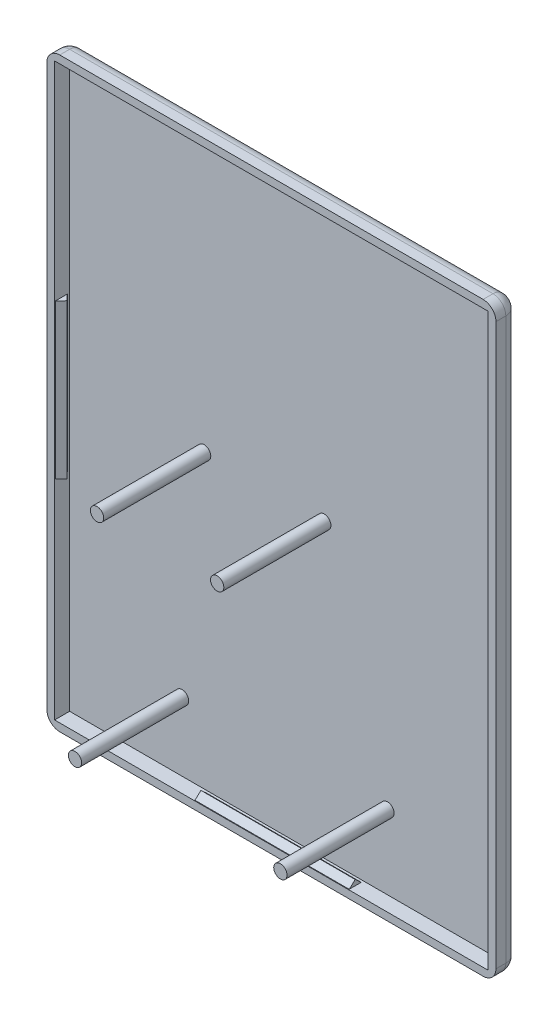
ISO-10303-21;
HEADER;
FILE_DESCRIPTION(('STEP AP214'),'2;1');
FILE_NAME('part.step','',(''),(''),'','','');
FILE_SCHEMA(('AUTOMOTIVE_DESIGN { 1 0 10303 214 1 1 1 1 }'));
ENDSEC;
DATA;
#1=APPLICATION_CONTEXT('core data for automotive mechanical design processes');
#2=APPLICATION_PROTOCOL_DEFINITION('international standard','automotive_design',2000,#1);
#3=PRODUCT_CONTEXT('',#1,'mechanical');
#4=PRODUCT('Part','Part','',(#3));
#5=PRODUCT_RELATED_PRODUCT_CATEGORY('part','',(#4));
#6=PRODUCT_DEFINITION_FORMATION('','',#4);
#7=PRODUCT_DEFINITION_CONTEXT('part definition',#1,'design');
#8=PRODUCT_DEFINITION('design','',#6,#7);
#9=PRODUCT_DEFINITION_SHAPE('','',#8);
#10=(LENGTH_UNIT() NAMED_UNIT(*) SI_UNIT(.MILLI.,.METRE.));
#11=(NAMED_UNIT(*) PLANE_ANGLE_UNIT() SI_UNIT($,.RADIAN.));
#12=(NAMED_UNIT(*) SI_UNIT($,.STERADIAN.) SOLID_ANGLE_UNIT());
#13=UNCERTAINTY_MEASURE_WITH_UNIT(LENGTH_MEASURE(1.E-05),#10,'distance_accuracy_value','');
#14=(GEOMETRIC_REPRESENTATION_CONTEXT(3) GLOBAL_UNCERTAINTY_ASSIGNED_CONTEXT((#13)) GLOBAL_UNIT_ASSIGNED_CONTEXT((#10,
#11,#12)) REPRESENTATION_CONTEXT('',''));
#15=CARTESIAN_POINT('',(0.,0.,0.));
#16=DIRECTION('',(0.,0.,1.));
#17=DIRECTION('',(1.,0.,0.));
#18=AXIS2_PLACEMENT_3D('',#15,#16,#17);
#19=CARTESIAN_POINT('',(0.,0.,0.));
#20=DIRECTION('',(0.,0.,-1.));
#21=DIRECTION('',(-1.,0.,0.));
#22=AXIS2_PLACEMENT_3D('',#19,#20,#21);
#23=PLANE('',#22);
#24=DIRECTION('',(0.,1.,0.));
#25=VECTOR('',#24,1.);
#26=CARTESIAN_POINT('',(52.4,-66.6,0.));
#27=LINE('',#26,#25);
#28=CARTESIAN_POINT('',(52.4,-65.4,0.));
#29=VERTEX_POINT('',#28);
#30=CARTESIAN_POINT('',(52.4,65.4,0.));
#31=VERTEX_POINT('',#30);
#32=EDGE_CURVE('E411',#29,#31,#27,.T.);
#33=ORIENTED_EDGE('',*,*,#32,.T.);
#34=CARTESIAN_POINT('',(49.4,65.4,0.));
#35=DIRECTION('',(0.,0.,-1.));
#36=DIRECTION('',(-1.,0.,0.));
#37=AXIS2_PLACEMENT_3D('',#34,#35,#36);
#38=CIRCLE('',#37,3.);
#39=CARTESIAN_POINT('',(49.4,68.4,0.));
#40=VERTEX_POINT('',#39);
#41=EDGE_CURVE('E442',#31,#40,#38,.F.);
#42=ORIENTED_EDGE('',*,*,#41,.T.);
#43=DIRECTION('',(-1.,0.,0.));
#44=VECTOR('',#43,1.);
#45=CARTESIAN_POINT('',(-50.6,68.4,0.));
#46=LINE('',#45,#44);
#47=CARTESIAN_POINT('',(-49.4,68.4,0.));
#48=VERTEX_POINT('',#47);
#49=EDGE_CURVE('E420',#40,#48,#46,.T.);
#50=ORIENTED_EDGE('',*,*,#49,.T.);
#51=CARTESIAN_POINT('',(-49.4,65.4,0.));
#52=DIRECTION('',(0.,0.,-1.));
#53=DIRECTION('',(-1.,0.,0.));
#54=AXIS2_PLACEMENT_3D('',#51,#52,#53);
#55=CIRCLE('',#54,3.);
#56=CARTESIAN_POINT('',(-52.4,65.4,0.));
#57=VERTEX_POINT('',#56);
#58=EDGE_CURVE('E436',#48,#57,#55,.F.);
#59=ORIENTED_EDGE('',*,*,#58,.T.);
#60=DIRECTION('',(0.,-1.,0.));
#61=VECTOR('',#60,1.);
#62=CARTESIAN_POINT('',(-52.4,-66.6,0.));
#63=LINE('',#62,#61);
#64=CARTESIAN_POINT('',(-52.4,-65.4,0.));
#65=VERTEX_POINT('',#64);
#66=EDGE_CURVE('E423',#57,#65,#63,.T.);
#67=ORIENTED_EDGE('',*,*,#66,.T.);
#68=CARTESIAN_POINT('',(-49.4,-65.4,0.));
#69=DIRECTION('',(0.,0.,-1.));
#70=DIRECTION('',(-1.,0.,0.));
#71=AXIS2_PLACEMENT_3D('',#68,#69,#70);
#72=CIRCLE('',#71,3.);
#73=CARTESIAN_POINT('',(-49.4,-68.4,0.));
#74=VERTEX_POINT('',#73);
#75=EDGE_CURVE('E438',#65,#74,#72,.F.);
#76=ORIENTED_EDGE('',*,*,#75,.T.);
#77=DIRECTION('',(1.,0.,0.));
#78=VECTOR('',#77,1.);
#79=CARTESIAN_POINT('',(-50.6,-68.4,0.));
#80=LINE('',#79,#78);
#81=CARTESIAN_POINT('',(49.4,-68.4,0.));
#82=VERTEX_POINT('',#81);
#83=EDGE_CURVE('E426',#74,#82,#80,.T.);
#84=ORIENTED_EDGE('',*,*,#83,.T.);
#85=CARTESIAN_POINT('',(49.4,-65.4,0.));
#86=DIRECTION('',(0.,0.,-1.));
#87=DIRECTION('',(-1.,0.,0.));
#88=AXIS2_PLACEMENT_3D('',#85,#86,#87);
#89=CIRCLE('',#88,3.);
#90=EDGE_CURVE('E440',#82,#29,#89,.F.);
#91=ORIENTED_EDGE('',*,*,#90,.T.);
#92=EDGE_LOOP('',(#33,#42,#50,#59,#67,#76,#84,#91));
#93=FACE_BOUND('',#92,.T.);
#94=DIRECTION('',(0.,1.,0.));
#95=VECTOR('',#94,1.);
#96=CARTESIAN_POINT('',(50.6,-66.6,0.));
#97=LINE('',#96,#95);
#98=CARTESIAN_POINT('',(50.6,-66.6,0.));
#99=VERTEX_POINT('',#98);
#100=CARTESIAN_POINT('',(50.6,66.6,0.));
#101=VERTEX_POINT('',#100);
#102=EDGE_CURVE('E398',#99,#101,#97,.T.);
#103=ORIENTED_EDGE('',*,*,#102,.F.);
#104=DIRECTION('',(1.,0.,0.));
#105=VECTOR('',#104,1.);
#106=CARTESIAN_POINT('',(-50.6,-66.6,0.));
#107=LINE('',#106,#105);
#108=CARTESIAN_POINT('',(-50.6,-66.6,0.));
#109=VERTEX_POINT('',#108);
#110=EDGE_CURVE('E388',#109,#99,#107,.T.);
#111=ORIENTED_EDGE('',*,*,#110,.F.);
#112=DIRECTION('',(0.,-1.,0.));
#113=VECTOR('',#112,1.);
#114=CARTESIAN_POINT('',(-50.6,-66.6,0.));
#115=LINE('',#114,#113);
#116=CARTESIAN_POINT('',(-50.6,66.6,0.));
#117=VERTEX_POINT('',#116);
#118=EDGE_CURVE('E405',#117,#109,#115,.T.);
#119=ORIENTED_EDGE('',*,*,#118,.F.);
#120=DIRECTION('',(-1.,0.,0.));
#121=VECTOR('',#120,1.);
#122=CARTESIAN_POINT('',(-50.6,66.6,0.));
#123=LINE('',#122,#121);
#124=EDGE_CURVE('E401',#101,#117,#123,.T.);
#125=ORIENTED_EDGE('',*,*,#124,.F.);
#126=EDGE_LOOP('',(#103,#111,#119,#125));
#127=FACE_BOUND('',#126,.T.);
#128=ADVANCED_FACE('F38',(#93,#127),#23,.F.);
#129=CARTESIAN_POINT('',(52.4,-66.6,-3.5));
#130=DIRECTION('',(1.,0.,0.));
#131=DIRECTION('',(0.,0.,-1.));
#132=AXIS2_PLACEMENT_3D('',#129,#130,#131);
#133=PLANE('',#132);
#134=DIRECTION('',(0.,1.,0.));
#135=VECTOR('',#134,1.);
#136=CARTESIAN_POINT('',(52.4,-66.6,-2.3));
#137=LINE('',#136,#135);
#138=CARTESIAN_POINT('',(52.4,-65.4,-2.3));
#139=VERTEX_POINT('',#138);
#140=CARTESIAN_POINT('',(52.4,65.4,-2.3));
#141=VERTEX_POINT('',#140);
#142=EDGE_CURVE('E429',#139,#141,#137,.T.);
#143=ORIENTED_EDGE('',*,*,#142,.T.);
#144=DIRECTION('',(0.,0.,1.));
#145=VECTOR('',#144,1.);
#146=CARTESIAN_POINT('',(52.4,65.4,-3.5));
#147=LINE('',#146,#145);
#148=EDGE_CURVE('E433',#141,#31,#147,.T.);
#149=ORIENTED_EDGE('',*,*,#148,.T.);
#150=ORIENTED_EDGE('',*,*,#32,.F.);
#151=DIRECTION('',(0.,0.,1.));
#152=VECTOR('',#151,1.);
#153=CARTESIAN_POINT('',(52.4,-65.4,-3.5));
#154=LINE('',#153,#152);
#155=EDGE_CURVE('E431',#29,#139,#154,.F.);
#156=ORIENTED_EDGE('',*,*,#155,.T.);
#157=EDGE_LOOP('',(#143,#149,#150,#156));
#158=FACE_BOUND('',#157,.T.);
#159=ADVANCED_FACE('F542',(#158),#133,.T.);
#160=CARTESIAN_POINT('',(-50.6,-68.4,-3.5));
#161=DIRECTION('',(0.,-1.,0.));
#162=DIRECTION('',(0.,0.,-1.));
#163=AXIS2_PLACEMENT_3D('',#160,#161,#162);
#164=PLANE('',#163);
#165=DIRECTION('',(1.,0.,0.));
#166=VECTOR('',#165,1.);
#167=CARTESIAN_POINT('',(-50.6,-68.4,-2.3));
#168=LINE('',#167,#166);
#169=CARTESIAN_POINT('',(-49.4,-68.4,-2.3));
#170=VERTEX_POINT('',#169);
#171=CARTESIAN_POINT('',(49.4,-68.4,-2.3));
#172=VERTEX_POINT('',#171);
#173=EDGE_CURVE('E450',#170,#172,#168,.T.);
#174=ORIENTED_EDGE('',*,*,#173,.T.);
#175=DIRECTION('',(0.,0.,1.));
#176=VECTOR('',#175,1.);
#177=CARTESIAN_POINT('',(49.4,-68.4,-3.5));
#178=LINE('',#177,#176);
#179=EDGE_CURVE('E454',#172,#82,#178,.T.);
#180=ORIENTED_EDGE('',*,*,#179,.T.);
#181=ORIENTED_EDGE('',*,*,#83,.F.);
#182=DIRECTION('',(0.,0.,1.));
#183=VECTOR('',#182,1.);
#184=CARTESIAN_POINT('',(-49.4,-68.4,-3.5));
#185=LINE('',#184,#183);
#186=EDGE_CURVE('E452',#74,#170,#185,.F.);
#187=ORIENTED_EDGE('',*,*,#186,.T.);
#188=EDGE_LOOP('',(#174,#180,#181,#187));
#189=FACE_BOUND('',#188,.T.);
#190=ADVANCED_FACE('F548',(#189),#164,.T.);
#191=CARTESIAN_POINT('',(-52.4,-66.6,-3.5));
#192=DIRECTION('',(-1.,0.,0.));
#193=DIRECTION('',(0.,0.,1.));
#194=AXIS2_PLACEMENT_3D('',#191,#192,#193);
#195=PLANE('',#194);
#196=DIRECTION('',(0.,-1.,0.));
#197=VECTOR('',#196,1.);
#198=CARTESIAN_POINT('',(-52.4,-66.6,-2.3));
#199=LINE('',#198,#197);
#200=CARTESIAN_POINT('',(-52.4,65.4,-2.3));
#201=VERTEX_POINT('',#200);
#202=CARTESIAN_POINT('',(-52.4,-65.4,-2.3));
#203=VERTEX_POINT('',#202);
#204=EDGE_CURVE('E456',#201,#203,#199,.T.);
#205=ORIENTED_EDGE('',*,*,#204,.T.);
#206=DIRECTION('',(0.,0.,1.));
#207=VECTOR('',#206,1.);
#208=CARTESIAN_POINT('',(-52.4,-65.4,-3.5));
#209=LINE('',#208,#207);
#210=EDGE_CURVE('E460',#203,#65,#209,.T.);
#211=ORIENTED_EDGE('',*,*,#210,.T.);
#212=ORIENTED_EDGE('',*,*,#66,.F.);
#213=DIRECTION('',(0.,0.,1.));
#214=VECTOR('',#213,1.);
#215=CARTESIAN_POINT('',(-52.4,65.4,-3.5));
#216=LINE('',#215,#214);
#217=EDGE_CURVE('E458',#57,#201,#216,.F.);
#218=ORIENTED_EDGE('',*,*,#217,.T.);
#219=EDGE_LOOP('',(#205,#211,#212,#218));
#220=FACE_BOUND('',#219,.T.);
#221=ADVANCED_FACE('F556',(#220),#195,.T.);
#222=CARTESIAN_POINT('',(-50.6,68.4,-3.5));
#223=DIRECTION('',(0.,1.,0.));
#224=DIRECTION('',(0.,0.,1.));
#225=AXIS2_PLACEMENT_3D('',#222,#223,#224);
#226=PLANE('',#225);
#227=ORIENTED_EDGE('',*,*,#49,.F.);
#228=DIRECTION('',(0.,0.,1.));
#229=VECTOR('',#228,1.);
#230=CARTESIAN_POINT('',(49.4,68.4,-3.5));
#231=LINE('',#230,#229);
#232=CARTESIAN_POINT('',(49.4,68.4,-2.3));
#233=VERTEX_POINT('',#232);
#234=EDGE_CURVE('E448',#40,#233,#231,.F.);
#235=ORIENTED_EDGE('',*,*,#234,.T.);
#236=DIRECTION('',(-1.,0.,0.));
#237=VECTOR('',#236,1.);
#238=CARTESIAN_POINT('',(-50.6,68.4,-2.3));
#239=LINE('',#238,#237);
#240=CARTESIAN_POINT('',(-49.4,68.4,-2.3));
#241=VERTEX_POINT('',#240);
#242=EDGE_CURVE('E444',#233,#241,#239,.T.);
#243=ORIENTED_EDGE('',*,*,#242,.T.);
#244=DIRECTION('',(0.,0.,1.));
#245=VECTOR('',#244,1.);
#246=CARTESIAN_POINT('',(-49.4,68.4,-3.5));
#247=LINE('',#246,#245);
#248=EDGE_CURVE('E446',#241,#48,#247,.T.);
#249=ORIENTED_EDGE('',*,*,#248,.T.);
#250=EDGE_LOOP('',(#227,#235,#243,#249));
#251=FACE_BOUND('',#250,.T.);
#252=ADVANCED_FACE('F560',(#251),#226,.T.);
#253=CARTESIAN_POINT('',(0.,0.,-5.3));
#254=DIRECTION('',(0.,0.,-1.));
#255=DIRECTION('',(-1.,0.,0.));
#256=AXIS2_PLACEMENT_3D('',#253,#254,#255);
#257=PLANE('',#256);
#258=DIRECTION('',(0.,1.,0.));
#259=VECTOR('',#258,1.);
#260=CARTESIAN_POINT('',(49.4,0.,-5.3));
#261=LINE('',#260,#259);
#262=CARTESIAN_POINT('',(49.4,65.4,-5.3));
#263=VERTEX_POINT('',#262);
#264=CARTESIAN_POINT('',(49.4,-65.4,-5.3));
#265=VERTEX_POINT('',#264);
#266=EDGE_CURVE('E462',#263,#265,#261,.F.);
#267=ORIENTED_EDGE('',*,*,#266,.T.);
#268=DIRECTION('',(1.,0.,0.));
#269=VECTOR('',#268,1.);
#270=CARTESIAN_POINT('',(0.,-65.4,-5.3));
#271=LINE('',#270,#269);
#272=CARTESIAN_POINT('',(-49.4,-65.4,-5.3));
#273=VERTEX_POINT('',#272);
#274=EDGE_CURVE('E468',#265,#273,#271,.F.);
#275=ORIENTED_EDGE('',*,*,#274,.T.);
#276=DIRECTION('',(0.,-1.,0.));
#277=VECTOR('',#276,1.);
#278=CARTESIAN_POINT('',(-49.4,0.,-5.3));
#279=LINE('',#278,#277);
#280=CARTESIAN_POINT('',(-49.4,65.4,-5.3));
#281=VERTEX_POINT('',#280);
#282=EDGE_CURVE('E466',#273,#281,#279,.F.);
#283=ORIENTED_EDGE('',*,*,#282,.T.);
#284=DIRECTION('',(-1.,0.,0.));
#285=VECTOR('',#284,1.);
#286=CARTESIAN_POINT('',(0.,65.4,-5.3));
#287=LINE('',#286,#285);
#288=EDGE_CURVE('E464',#281,#263,#287,.F.);
#289=ORIENTED_EDGE('',*,*,#288,.T.);
#290=EDGE_LOOP('',(#267,#275,#283,#289));
#291=FACE_BOUND('',#290,.T.);
#292=ADVANCED_FACE('F564',(#291),#257,.T.);
#293=CARTESIAN_POINT('',(50.6,-66.6,-3.5));
#294=DIRECTION('',(1.,0.,0.));
#295=DIRECTION('',(0.,0.,-1.));
#296=AXIS2_PLACEMENT_3D('',#293,#294,#295);
#297=PLANE('',#296);
#298=DIRECTION('',(0.,-1.,0.));
#299=VECTOR('',#298,1.);
#300=CARTESIAN_POINT('',(50.6,0.,-0.15));
#301=LINE('',#300,#299);
#302=CARTESIAN_POINT('',(50.6,18.,-0.15));
#303=VERTEX_POINT('',#302);
#304=CARTESIAN_POINT('',(50.6,-18.,-0.15));
#305=VERTEX_POINT('',#304);
#306=EDGE_CURVE('E364',#303,#305,#301,.T.);
#307=ORIENTED_EDGE('',*,*,#306,.T.);
#308=DIRECTION('',(0.,0.,-1.));
#309=VECTOR('',#308,1.);
#310=CARTESIAN_POINT('',(50.6,-18.,-0.15));
#311=LINE('',#310,#309);
#312=CARTESIAN_POINT('',(50.6,-18.,-2.95));
#313=VERTEX_POINT('',#312);
#314=EDGE_CURVE('E360',#305,#313,#311,.T.);
#315=ORIENTED_EDGE('',*,*,#314,.T.);
#316=DIRECTION('',(0.,-1.,0.));
#317=VECTOR('',#316,1.);
#318=CARTESIAN_POINT('',(50.6,0.,-2.95));
#319=LINE('',#318,#317);
#320=CARTESIAN_POINT('',(50.6,18.,-2.95));
#321=VERTEX_POINT('',#320);
#322=EDGE_CURVE('E361',#321,#313,#319,.T.);
#323=ORIENTED_EDGE('',*,*,#322,.F.);
#324=DIRECTION('',(0.,0.,-1.));
#325=VECTOR('',#324,1.);
#326=CARTESIAN_POINT('',(50.6,18.,-0.15));
#327=LINE('',#326,#325);
#328=EDGE_CURVE('E344',#303,#321,#327,.T.);
#329=ORIENTED_EDGE('',*,*,#328,.F.);
#330=EDGE_LOOP('',(#307,#315,#323,#329));
#331=FACE_BOUND('',#330,.T.);
#332=ORIENTED_EDGE('',*,*,#102,.T.);
#333=DIRECTION('',(0.,0.,1.));
#334=VECTOR('',#333,1.);
#335=CARTESIAN_POINT('',(50.6,66.6,-3.5));
#336=LINE('',#335,#334);
#337=CARTESIAN_POINT('',(50.6,66.6,-3.5));
#338=VERTEX_POINT('',#337);
#339=EDGE_CURVE('E397',#338,#101,#336,.T.);
#340=ORIENTED_EDGE('',*,*,#339,.F.);
#341=DIRECTION('',(0.,1.,0.));
#342=VECTOR('',#341,1.);
#343=CARTESIAN_POINT('',(50.6,-66.6,-3.5));
#344=LINE('',#343,#342);
#345=CARTESIAN_POINT('',(50.6,-66.6,-3.5));
#346=VERTEX_POINT('',#345);
#347=EDGE_CURVE('E384',#346,#338,#344,.T.);
#348=ORIENTED_EDGE('',*,*,#347,.F.);
#349=DIRECTION('',(0.,0.,1.));
#350=VECTOR('',#349,1.);
#351=CARTESIAN_POINT('',(50.6,-66.6,-3.5));
#352=LINE('',#351,#350);
#353=EDGE_CURVE('E409',#346,#99,#352,.T.);
#354=ORIENTED_EDGE('',*,*,#353,.T.);
#355=EDGE_LOOP('',(#332,#340,#348,#354));
#356=FACE_BOUND('',#355,.T.);
#357=ADVANCED_FACE('F529',(#331,#356),#297,.F.);
#358=CARTESIAN_POINT('',(-50.6,-66.6,-3.5));
#359=DIRECTION('',(0.,-1.,0.));
#360=DIRECTION('',(0.,0.,-1.));
#361=AXIS2_PLACEMENT_3D('',#358,#359,#360);
#362=PLANE('',#361);
#363=DIRECTION('',(1.,0.,0.));
#364=VECTOR('',#363,1.);
#365=CARTESIAN_POINT('',(0.,-66.6,-2.95));
#366=LINE('',#365,#364);
#367=CARTESIAN_POINT('',(-18.,-66.6,-2.94999999999997));
#368=VERTEX_POINT('',#367);
#369=CARTESIAN_POINT('',(18.,-66.6,-2.94999999999997));
#370=VERTEX_POINT('',#369);
#371=EDGE_CURVE('E53',#368,#370,#366,.T.);
#372=ORIENTED_EDGE('',*,*,#371,.T.);
#373=DIRECTION('',(0.,0.,-1.));
#374=VECTOR('',#373,1.);
#375=CARTESIAN_POINT('',(18.,-66.6,-0.15));
#376=LINE('',#375,#374);
#377=CARTESIAN_POINT('',(18.,-66.6,-0.15000000000003));
#378=VERTEX_POINT('',#377);
#379=EDGE_CURVE('E57',#378,#370,#376,.T.);
#380=ORIENTED_EDGE('',*,*,#379,.F.);
#381=DIRECTION('',(1.,0.,0.));
#382=VECTOR('',#381,1.);
#383=CARTESIAN_POINT('',(0.,-66.6,-0.15));
#384=LINE('',#383,#382);
#385=CARTESIAN_POINT('',(-18.,-66.6,-0.15));
#386=VERTEX_POINT('',#385);
#387=EDGE_CURVE('E230',#386,#378,#384,.T.);
#388=ORIENTED_EDGE('',*,*,#387,.F.);
#389=DIRECTION('',(0.,0.,-1.));
#390=VECTOR('',#389,1.);
#391=CARTESIAN_POINT('',(-18.,-66.6,-0.15));
#392=LINE('',#391,#390);
#393=EDGE_CURVE('E226',#386,#368,#392,.T.);
#394=ORIENTED_EDGE('',*,*,#393,.T.);
#395=EDGE_LOOP('',(#372,#380,#388,#394));
#396=FACE_BOUND('',#395,.T.);
#397=ORIENTED_EDGE('',*,*,#110,.T.);
#398=ORIENTED_EDGE('',*,*,#353,.F.);
#399=DIRECTION('',(1.,0.,0.));
#400=VECTOR('',#399,1.);
#401=CARTESIAN_POINT('',(-50.6,-66.6,-3.5));
#402=LINE('',#401,#400);
#403=CARTESIAN_POINT('',(-50.6,-66.6,-3.5));
#404=VERTEX_POINT('',#403);
#405=EDGE_CURVE('E394',#404,#346,#402,.T.);
#406=ORIENTED_EDGE('',*,*,#405,.F.);
#407=DIRECTION('',(0.,0.,1.));
#408=VECTOR('',#407,1.);
#409=CARTESIAN_POINT('',(-50.6,-66.6,-3.5));
#410=LINE('',#409,#408);
#411=EDGE_CURVE('E412',#404,#109,#410,.T.);
#412=ORIENTED_EDGE('',*,*,#411,.T.);
#413=EDGE_LOOP('',(#397,#398,#406,#412));
#414=FACE_BOUND('',#413,.T.);
#415=ADVANCED_FACE('F538',(#396,#414),#362,.F.);
#416=CARTESIAN_POINT('',(-50.6,-66.6,-3.5));
#417=DIRECTION('',(-1.,0.,0.));
#418=DIRECTION('',(0.,0.,1.));
#419=AXIS2_PLACEMENT_3D('',#416,#417,#418);
#420=PLANE('',#419);
#421=DIRECTION('',(0.,-1.,0.));
#422=VECTOR('',#421,1.);
#423=CARTESIAN_POINT('',(-50.6,0.,-2.95));
#424=LINE('',#423,#422);
#425=CARTESIAN_POINT('',(-50.6,18.,-2.95000000000003));
#426=VERTEX_POINT('',#425);
#427=CARTESIAN_POINT('',(-50.6,-18.,-2.95000000000003));
#428=VERTEX_POINT('',#427);
#429=EDGE_CURVE('E324',#426,#428,#424,.T.);
#430=ORIENTED_EDGE('',*,*,#429,.T.);
#431=DIRECTION('',(0.,0.,-1.));
#432=VECTOR('',#431,1.);
#433=CARTESIAN_POINT('',(-50.6,-18.,-0.15));
#434=LINE('',#433,#432);
#435=CARTESIAN_POINT('',(-50.6,-18.,-0.14999999999997));
#436=VERTEX_POINT('',#435);
#437=EDGE_CURVE('E308',#436,#428,#434,.T.);
#438=ORIENTED_EDGE('',*,*,#437,.F.);
#439=DIRECTION('',(0.,-1.,0.));
#440=VECTOR('',#439,1.);
#441=CARTESIAN_POINT('',(-50.6,0.,-0.15));
#442=LINE('',#441,#440);
#443=CARTESIAN_POINT('',(-50.6,18.,-0.15));
#444=VERTEX_POINT('',#443);
#445=EDGE_CURVE('E321',#444,#436,#442,.T.);
#446=ORIENTED_EDGE('',*,*,#445,.F.);
#447=DIRECTION('',(0.,0.,-1.));
#448=VECTOR('',#447,1.);
#449=CARTESIAN_POINT('',(-50.6,18.,-0.15));
#450=LINE('',#449,#448);
#451=EDGE_CURVE('E290',#444,#426,#450,.T.);
#452=ORIENTED_EDGE('',*,*,#451,.T.);
#453=EDGE_LOOP('',(#430,#438,#446,#452));
#454=FACE_BOUND('',#453,.T.);
#455=ORIENTED_EDGE('',*,*,#118,.T.);
#456=ORIENTED_EDGE('',*,*,#411,.F.);
#457=DIRECTION('',(0.,-1.,0.));
#458=VECTOR('',#457,1.);
#459=CARTESIAN_POINT('',(-50.6,-66.6,-3.5));
#460=LINE('',#459,#458);
#461=CARTESIAN_POINT('',(-50.6,66.6,-3.5));
#462=VERTEX_POINT('',#461);
#463=EDGE_CURVE('E391',#462,#404,#460,.T.);
#464=ORIENTED_EDGE('',*,*,#463,.F.);
#465=DIRECTION('',(0.,0.,1.));
#466=VECTOR('',#465,1.);
#467=CARTESIAN_POINT('',(-50.6,66.6,-3.5));
#468=LINE('',#467,#466);
#469=EDGE_CURVE('E415',#462,#117,#468,.T.);
#470=ORIENTED_EDGE('',*,*,#469,.T.);
#471=EDGE_LOOP('',(#455,#456,#464,#470));
#472=FACE_BOUND('',#471,.T.);
#473=ADVANCED_FACE('F536',(#454,#472),#420,.F.);
#474=CARTESIAN_POINT('',(-50.6,66.6,-3.5));
#475=DIRECTION('',(0.,1.,0.));
#476=DIRECTION('',(0.,0.,1.));
#477=AXIS2_PLACEMENT_3D('',#474,#475,#476);
#478=PLANE('',#477);
#479=DIRECTION('',(1.,0.,0.));
#480=VECTOR('',#479,1.);
#481=CARTESIAN_POINT('',(0.,66.6,-0.15));
#482=LINE('',#481,#480);
#483=CARTESIAN_POINT('',(-18.,66.6,-0.15));
#484=VERTEX_POINT('',#483);
#485=CARTESIAN_POINT('',(18.,66.6,-0.15));
#486=VERTEX_POINT('',#485);
#487=EDGE_CURVE('E280',#484,#486,#482,.T.);
#488=ORIENTED_EDGE('',*,*,#487,.T.);
#489=DIRECTION('',(0.,0.,-1.));
#490=VECTOR('',#489,1.);
#491=CARTESIAN_POINT('',(18.,66.6,-0.15));
#492=LINE('',#491,#490);
#493=CARTESIAN_POINT('',(18.,66.6,-2.95));
#494=VERTEX_POINT('',#493);
#495=EDGE_CURVE('E276',#486,#494,#492,.T.);
#496=ORIENTED_EDGE('',*,*,#495,.T.);
#497=DIRECTION('',(1.,0.,0.));
#498=VECTOR('',#497,1.);
#499=CARTESIAN_POINT('',(0.,66.6,-2.95));
#500=LINE('',#499,#498);
#501=CARTESIAN_POINT('',(-18.,66.6,-2.95));
#502=VERTEX_POINT('',#501);
#503=EDGE_CURVE('E277',#502,#494,#500,.T.);
#504=ORIENTED_EDGE('',*,*,#503,.F.);
#505=DIRECTION('',(0.,0.,-1.));
#506=VECTOR('',#505,1.);
#507=CARTESIAN_POINT('',(-18.,66.6,-0.15));
#508=LINE('',#507,#506);
#509=EDGE_CURVE('E260',#484,#502,#508,.T.);
#510=ORIENTED_EDGE('',*,*,#509,.F.);
#511=EDGE_LOOP('',(#488,#496,#504,#510));
#512=FACE_BOUND('',#511,.T.);
#513=ORIENTED_EDGE('',*,*,#124,.T.);
#514=ORIENTED_EDGE('',*,*,#469,.F.);
#515=DIRECTION('',(-1.,0.,0.));
#516=VECTOR('',#515,1.);
#517=CARTESIAN_POINT('',(-50.6,66.6,-3.5));
#518=LINE('',#517,#516);
#519=EDGE_CURVE('E387',#338,#462,#518,.T.);
#520=ORIENTED_EDGE('',*,*,#519,.F.);
#521=ORIENTED_EDGE('',*,*,#339,.T.);
#522=EDGE_LOOP('',(#513,#514,#520,#521));
#523=FACE_BOUND('',#522,.T.);
#524=ADVANCED_FACE('F518',(#512,#523),#478,.F.);
#525=CARTESIAN_POINT('',(0.,0.,-3.5));
#526=DIRECTION('',(0.,0.,-1.));
#527=DIRECTION('',(-1.,0.,0.));
#528=AXIS2_PLACEMENT_3D('',#525,#526,#527);
#529=PLANE('',#528);
#530=CARTESIAN_POINT('',(-19.205,1.44000000000002,-3.5));
#531=DIRECTION('',(0.,0.,-1.));
#532=DIRECTION('',(-1.,0.,0.));
#533=AXIS2_PLACEMENT_3D('',#530,#531,#532);
#534=CIRCLE('',#533,1.55);
#535=CARTESIAN_POINT('',(-20.755,1.44000000000002,-3.5));
#536=VERTEX_POINT('',#535);
#537=EDGE_CURVE('E12',#536,#536,#534,.F.);
#538=ORIENTED_EDGE('',*,*,#537,.F.);
#539=EDGE_LOOP('',(#538));
#540=FACE_BOUND('',#539,.T.);
#541=CARTESIAN_POINT('',(8.83499999999997,1.44000000000002,-3.5));
#542=DIRECTION('',(0.,0.,-1.));
#543=DIRECTION('',(-1.,0.,0.));
#544=AXIS2_PLACEMENT_3D('',#541,#542,#543);
#545=CIRCLE('',#544,1.55);
#546=CARTESIAN_POINT('',(7.28499999999998,1.44000000000002,-3.5));
#547=VERTEX_POINT('',#546);
#548=EDGE_CURVE('E46',#547,#547,#545,.F.);
#549=ORIENTED_EDGE('',*,*,#548,.F.);
#550=EDGE_LOOP('',(#549));
#551=FACE_BOUND('',#550,.T.);
#552=CARTESIAN_POINT('',(23.585,-49.36,-3.5));
#553=DIRECTION('',(0.,0.,-1.));
#554=DIRECTION('',(-1.,0.,0.));
#555=AXIS2_PLACEMENT_3D('',#552,#553,#554);
#556=CIRCLE('',#555,1.55);
#557=CARTESIAN_POINT('',(22.035,-49.36,-3.5));
#558=VERTEX_POINT('',#557);
#559=EDGE_CURVE('E508',#558,#558,#556,.F.);
#560=ORIENTED_EDGE('',*,*,#559,.F.);
#561=EDGE_LOOP('',(#560));
#562=FACE_BOUND('',#561,.T.);
#563=CARTESIAN_POINT('',(-24.345,-50.63,-3.5));
#564=DIRECTION('',(0.,0.,-1.));
#565=DIRECTION('',(-1.,0.,0.));
#566=AXIS2_PLACEMENT_3D('',#563,#564,#565);
#567=CIRCLE('',#566,1.55);
#568=CARTESIAN_POINT('',(-25.895,-50.63,-3.5));
#569=VERTEX_POINT('',#568);
#570=EDGE_CURVE('E471',#569,#569,#567,.F.);
#571=ORIENTED_EDGE('',*,*,#570,.F.);
#572=EDGE_LOOP('',(#571));
#573=FACE_BOUND('',#572,.T.);
#574=ORIENTED_EDGE('',*,*,#347,.T.);
#575=ORIENTED_EDGE('',*,*,#519,.T.);
#576=ORIENTED_EDGE('',*,*,#463,.T.);
#577=ORIENTED_EDGE('',*,*,#405,.T.);
#578=EDGE_LOOP('',(#574,#575,#576,#577));
#579=FACE_BOUND('',#578,.T.);
#580=ADVANCED_FACE('F515',(#540,#551,#562,#573,#579),#529,.F.);
#581=CARTESIAN_POINT('',(-49.4,-65.4,-3.5));
#582=DIRECTION('',(0.,0.,1.));
#583=DIRECTION('',(1.,0.,0.));
#584=AXIS2_PLACEMENT_3D('',#581,#582,#583);
#585=CYLINDRICAL_SURFACE('',#584,3.);
#586=CARTESIAN_POINT('',(-49.4,-65.4,-2.3));
#587=DIRECTION('',(0.,0.,-1.));
#588=DIRECTION('',(-1.,0.,0.));
#589=AXIS2_PLACEMENT_3D('',#586,#587,#588);
#590=CIRCLE('',#589,3.);
#591=EDGE_CURVE('E402',#170,#203,#590,.T.);
#592=ORIENTED_EDGE('',*,*,#591,.F.);
#593=ORIENTED_EDGE('',*,*,#186,.F.);
#594=ORIENTED_EDGE('',*,*,#75,.F.);
#595=ORIENTED_EDGE('',*,*,#210,.F.);
#596=EDGE_LOOP('',(#592,#593,#594,#595));
#597=FACE_BOUND('',#596,.T.);
#598=ADVANCED_FACE('F40',(#597),#585,.T.);
#599=CARTESIAN_POINT('',(-49.4,-65.4,-2.3));
#600=DIRECTION('',(0.,0.,1.));
#601=DIRECTION('',(1.,0.,0.));
#602=AXIS2_PLACEMENT_3D('',#599,#600,#601);
#603=SPHERICAL_SURFACE('',#602,3.);
#604=CARTESIAN_POINT('',(-49.4,-65.4,-2.3));
#605=DIRECTION('',(-1.,0.,0.));
#606=DIRECTION('',(0.,0.,1.));
#607=AXIS2_PLACEMENT_3D('',#604,#605,#606);
#608=CIRCLE('',#607,3.);
#609=EDGE_CURVE('E498',#170,#273,#608,.F.);
#610=ORIENTED_EDGE('',*,*,#609,.F.);
#611=ORIENTED_EDGE('',*,*,#591,.T.);
#612=CARTESIAN_POINT('',(-49.4,-65.4,-2.3));
#613=DIRECTION('',(0.,-1.,0.));
#614=DIRECTION('',(0.,0.,-1.));
#615=AXIS2_PLACEMENT_3D('',#612,#613,#614);
#616=CIRCLE('',#615,3.);
#617=EDGE_CURVE('E501',#273,#203,#616,.F.);
#618=ORIENTED_EDGE('',*,*,#617,.F.);
#619=EDGE_LOOP('',(#610,#611,#618));
#620=FACE_BOUND('',#619,.T.);
#621=ADVANCED_FACE('F609',(#620),#603,.T.);
#622=CARTESIAN_POINT('',(-49.4,65.4,-3.5));
#623=DIRECTION('',(0.,0.,1.));
#624=DIRECTION('',(1.,0.,0.));
#625=AXIS2_PLACEMENT_3D('',#622,#623,#624);
#626=CYLINDRICAL_SURFACE('',#625,3.);
#627=ORIENTED_EDGE('',*,*,#58,.F.);
#628=ORIENTED_EDGE('',*,*,#248,.F.);
#629=CARTESIAN_POINT('',(-49.4,65.4,-2.3));
#630=DIRECTION('',(0.,0.,-1.));
#631=DIRECTION('',(-1.,0.,0.));
#632=AXIS2_PLACEMENT_3D('',#629,#630,#631);
#633=CIRCLE('',#632,3.);
#634=EDGE_CURVE('E495',#201,#241,#633,.T.);
#635=ORIENTED_EDGE('',*,*,#634,.F.);
#636=ORIENTED_EDGE('',*,*,#217,.F.);
#637=EDGE_LOOP('',(#627,#628,#635,#636));
#638=FACE_BOUND('',#637,.T.);
#639=ADVANCED_FACE('F606',(#638),#626,.T.);
#640=CARTESIAN_POINT('',(-49.4,-66.6,-2.3));
#641=DIRECTION('',(0.,-1.,0.));
#642=DIRECTION('',(0.,0.,-1.));
#643=AXIS2_PLACEMENT_3D('',#640,#641,#642);
#644=CYLINDRICAL_SURFACE('',#643,3.);
#645=ORIENTED_EDGE('',*,*,#617,.T.);
#646=ORIENTED_EDGE('',*,*,#204,.F.);
#647=CARTESIAN_POINT('',(-49.4,65.4,-2.3));
#648=DIRECTION('',(0.,1.,0.));
#649=DIRECTION('',(0.,0.,1.));
#650=AXIS2_PLACEMENT_3D('',#647,#648,#649);
#651=CIRCLE('',#650,3.);
#652=EDGE_CURVE('E492',#281,#201,#651,.T.);
#653=ORIENTED_EDGE('',*,*,#652,.F.);
#654=ORIENTED_EDGE('',*,*,#282,.F.);
#655=EDGE_LOOP('',(#645,#646,#653,#654));
#656=FACE_BOUND('',#655,.T.);
#657=ADVANCED_FACE('F602',(#656),#644,.T.);
#658=CARTESIAN_POINT('',(-50.6,-65.4,-2.3));
#659=DIRECTION('',(1.,0.,0.));
#660=DIRECTION('',(0.,0.,-1.));
#661=AXIS2_PLACEMENT_3D('',#658,#659,#660);
#662=CYLINDRICAL_SURFACE('',#661,3.);
#663=ORIENTED_EDGE('',*,*,#609,.T.);
#664=ORIENTED_EDGE('',*,*,#274,.F.);
#665=CARTESIAN_POINT('',(49.4,-65.4,-2.3));
#666=DIRECTION('',(1.,0.,0.));
#667=DIRECTION('',(0.,0.,-1.));
#668=AXIS2_PLACEMENT_3D('',#665,#666,#667);
#669=CIRCLE('',#668,3.);
#670=EDGE_CURVE('E489',#172,#265,#669,.T.);
#671=ORIENTED_EDGE('',*,*,#670,.F.);
#672=ORIENTED_EDGE('',*,*,#173,.F.);
#673=EDGE_LOOP('',(#663,#664,#671,#672));
#674=FACE_BOUND('',#673,.T.);
#675=ADVANCED_FACE('F598',(#674),#662,.T.);
#676=CARTESIAN_POINT('',(49.4,-65.4,-3.5));
#677=DIRECTION('',(0.,0.,1.));
#678=DIRECTION('',(1.,0.,0.));
#679=AXIS2_PLACEMENT_3D('',#676,#677,#678);
#680=CYLINDRICAL_SURFACE('',#679,3.);
#681=ORIENTED_EDGE('',*,*,#90,.F.);
#682=ORIENTED_EDGE('',*,*,#179,.F.);
#683=CARTESIAN_POINT('',(49.4,-65.4,-2.3));
#684=DIRECTION('',(0.,0.,-1.));
#685=DIRECTION('',(-1.,0.,0.));
#686=AXIS2_PLACEMENT_3D('',#683,#684,#685);
#687=CIRCLE('',#686,3.);
#688=EDGE_CURVE('E486',#139,#172,#687,.T.);
#689=ORIENTED_EDGE('',*,*,#688,.F.);
#690=ORIENTED_EDGE('',*,*,#155,.F.);
#691=EDGE_LOOP('',(#681,#682,#689,#690));
#692=FACE_BOUND('',#691,.T.);
#693=ADVANCED_FACE('F594',(#692),#680,.T.);
#694=CARTESIAN_POINT('',(-49.4,65.4,-2.3));
#695=DIRECTION('',(0.,0.,1.));
#696=DIRECTION('',(1.,0.,0.));
#697=AXIS2_PLACEMENT_3D('',#694,#695,#696);
#698=SPHERICAL_SURFACE('',#697,3.);
#699=ORIENTED_EDGE('',*,*,#652,.T.);
#700=ORIENTED_EDGE('',*,*,#634,.T.);
#701=CARTESIAN_POINT('',(-49.4,65.4,-2.3));
#702=DIRECTION('',(-1.,0.,0.));
#703=DIRECTION('',(0.,0.,1.));
#704=AXIS2_PLACEMENT_3D('',#701,#702,#703);
#705=CIRCLE('',#704,3.);
#706=EDGE_CURVE('E483',#281,#241,#705,.F.);
#707=ORIENTED_EDGE('',*,*,#706,.F.);
#708=EDGE_LOOP('',(#699,#700,#707));
#709=FACE_BOUND('',#708,.T.);
#710=ADVANCED_FACE('F590',(#709),#698,.T.);
#711=CARTESIAN_POINT('',(49.4,-65.4,-2.3));
#712=DIRECTION('',(0.,0.,1.));
#713=DIRECTION('',(1.,0.,0.));
#714=AXIS2_PLACEMENT_3D('',#711,#712,#713);
#715=SPHERICAL_SURFACE('',#714,3.);
#716=ORIENTED_EDGE('',*,*,#688,.T.);
#717=ORIENTED_EDGE('',*,*,#670,.T.);
#718=CARTESIAN_POINT('',(49.4,-65.4,-2.3));
#719=DIRECTION('',(0.,-1.,0.));
#720=DIRECTION('',(0.,0.,-1.));
#721=AXIS2_PLACEMENT_3D('',#718,#719,#720);
#722=CIRCLE('',#721,3.);
#723=EDGE_CURVE('E480',#139,#265,#722,.F.);
#724=ORIENTED_EDGE('',*,*,#723,.F.);
#725=EDGE_LOOP('',(#716,#717,#724));
#726=FACE_BOUND('',#725,.T.);
#727=ADVANCED_FACE('F586',(#726),#715,.T.);
#728=CARTESIAN_POINT('',(-50.6,65.4,-2.3));
#729=DIRECTION('',(-1.,0.,0.));
#730=DIRECTION('',(0.,0.,1.));
#731=AXIS2_PLACEMENT_3D('',#728,#729,#730);
#732=CYLINDRICAL_SURFACE('',#731,3.);
#733=ORIENTED_EDGE('',*,*,#706,.T.);
#734=ORIENTED_EDGE('',*,*,#242,.F.);
#735=CARTESIAN_POINT('',(49.4,65.4,-2.3));
#736=DIRECTION('',(1.,0.,0.));
#737=DIRECTION('',(0.,0.,-1.));
#738=AXIS2_PLACEMENT_3D('',#735,#736,#737);
#739=CIRCLE('',#738,3.);
#740=EDGE_CURVE('E477',#263,#233,#739,.T.);
#741=ORIENTED_EDGE('',*,*,#740,.F.);
#742=ORIENTED_EDGE('',*,*,#288,.F.);
#743=EDGE_LOOP('',(#733,#734,#741,#742));
#744=FACE_BOUND('',#743,.T.);
#745=ADVANCED_FACE('F582',(#744),#732,.T.);
#746=CARTESIAN_POINT('',(49.4,-66.6,-2.3));
#747=DIRECTION('',(0.,1.,0.));
#748=DIRECTION('',(0.,0.,1.));
#749=AXIS2_PLACEMENT_3D('',#746,#747,#748);
#750=CYLINDRICAL_SURFACE('',#749,3.);
#751=ORIENTED_EDGE('',*,*,#723,.T.);
#752=ORIENTED_EDGE('',*,*,#266,.F.);
#753=CARTESIAN_POINT('',(49.4,65.4,-2.3));
#754=DIRECTION('',(0.,1.,0.));
#755=DIRECTION('',(0.,0.,1.));
#756=AXIS2_PLACEMENT_3D('',#753,#754,#755);
#757=CIRCLE('',#756,3.);
#758=EDGE_CURVE('E474',#141,#263,#757,.T.);
#759=ORIENTED_EDGE('',*,*,#758,.F.);
#760=ORIENTED_EDGE('',*,*,#142,.F.);
#761=EDGE_LOOP('',(#751,#752,#759,#760));
#762=FACE_BOUND('',#761,.T.);
#763=ADVANCED_FACE('F578',(#762),#750,.T.);
#764=CARTESIAN_POINT('',(49.4,65.4,-2.3));
#765=DIRECTION('',(0.,0.,1.));
#766=DIRECTION('',(1.,0.,0.));
#767=AXIS2_PLACEMENT_3D('',#764,#765,#766);
#768=SPHERICAL_SURFACE('',#767,3.);
#769=ORIENTED_EDGE('',*,*,#758,.T.);
#770=ORIENTED_EDGE('',*,*,#740,.T.);
#771=CARTESIAN_POINT('',(49.4,65.4,-2.3));
#772=DIRECTION('',(0.,0.,-1.));
#773=DIRECTION('',(-1.,0.,0.));
#774=AXIS2_PLACEMENT_3D('',#771,#772,#773);
#775=CIRCLE('',#774,3.);
#776=EDGE_CURVE('E374',#141,#233,#775,.F.);
#777=ORIENTED_EDGE('',*,*,#776,.F.);
#778=EDGE_LOOP('',(#769,#770,#777));
#779=FACE_BOUND('',#778,.T.);
#780=ADVANCED_FACE('F573',(#779),#768,.T.);
#781=CARTESIAN_POINT('',(49.4,65.4,-3.5));
#782=DIRECTION('',(0.,0.,1.));
#783=DIRECTION('',(1.,0.,0.));
#784=AXIS2_PLACEMENT_3D('',#781,#782,#783);
#785=CYLINDRICAL_SURFACE('',#784,3.);
#786=ORIENTED_EDGE('',*,*,#776,.T.);
#787=ORIENTED_EDGE('',*,*,#234,.F.);
#788=ORIENTED_EDGE('',*,*,#41,.F.);
#789=ORIENTED_EDGE('',*,*,#148,.F.);
#790=EDGE_LOOP('',(#786,#787,#788,#789));
#791=FACE_BOUND('',#790,.T.);
#792=ADVANCED_FACE('F569',(#791),#785,.T.);
#793=CARTESIAN_POINT('',(0.,-18.,0.));
#794=DIRECTION('',(0.,-1.,0.));
#795=DIRECTION('',(0.,0.,-1.));
#796=AXIS2_PLACEMENT_3D('',#793,#794,#795);
#797=PLANE('',#796);
#798=DIRECTION('',(0.676064872561323,0.,0.736842105263157));
#799=VECTOR('',#798,1.);
#800=CARTESIAN_POINT('',(49.3154767421335,-18.,-1.55));
#801=LINE('',#800,#799);
#802=CARTESIAN_POINT('',(49.3154767421335,-18.,-1.55));
#803=VERTEX_POINT('',#802);
#804=EDGE_CURVE('E366',#803,#305,#801,.T.);
#805=ORIENTED_EDGE('',*,*,#804,.F.);
#806=DIRECTION('',(-0.676064872561323,0.,0.736842105263157));
#807=VECTOR('',#806,1.);
#808=CARTESIAN_POINT('',(50.6,-18.,-2.95));
#809=LINE('',#808,#807);
#810=EDGE_CURVE('E350',#313,#803,#809,.T.);
#811=ORIENTED_EDGE('',*,*,#810,.F.);
#812=ORIENTED_EDGE('',*,*,#314,.F.);
#813=EDGE_LOOP('',(#805,#811,#812));
#814=FACE_BOUND('',#813,.T.);
#815=ADVANCED_FACE('F572',(#814),#797,.T.);
#816=CARTESIAN_POINT('',(50.6,0.,-2.95));
#817=DIRECTION('',(0.736842105263157,0.,0.676064872561323));
#818=DIRECTION('',(0.676064872561323,0.,-0.736842105263157));
#819=AXIS2_PLACEMENT_3D('',#816,#817,#818);
#820=PLANE('',#819);
#821=ORIENTED_EDGE('',*,*,#810,.T.);
#822=DIRECTION('',(0.,-1.,0.));
#823=VECTOR('',#822,1.);
#824=CARTESIAN_POINT('',(49.3154767421335,0.,-1.55));
#825=LINE('',#824,#823);
#826=CARTESIAN_POINT('',(49.3154767421335,18.,-1.55));
#827=VERTEX_POINT('',#826);
#828=EDGE_CURVE('E357',#827,#803,#825,.T.);
#829=ORIENTED_EDGE('',*,*,#828,.F.);
#830=DIRECTION('',(-0.676064872561323,0.,0.736842105263157));
#831=VECTOR('',#830,1.);
#832=CARTESIAN_POINT('',(50.6,18.,-2.95));
#833=LINE('',#832,#831);
#834=EDGE_CURVE('E332',#321,#827,#833,.T.);
#835=ORIENTED_EDGE('',*,*,#834,.F.);
#836=ORIENTED_EDGE('',*,*,#322,.T.);
#837=EDGE_LOOP('',(#821,#829,#835,#836));
#838=FACE_BOUND('',#837,.T.);
#839=ADVANCED_FACE('F798',(#838),#820,.F.);
#840=CARTESIAN_POINT('',(49.3154767421335,0.,-1.55));
#841=DIRECTION('',(0.736842105263157,0.,-0.676064872561323));
#842=DIRECTION('',(-0.676064872561323,0.,-0.736842105263157));
#843=AXIS2_PLACEMENT_3D('',#840,#841,#842);
#844=PLANE('',#843);
#845=ORIENTED_EDGE('',*,*,#804,.T.);
#846=ORIENTED_EDGE('',*,*,#306,.F.);
#847=DIRECTION('',(0.676064872561323,0.,0.736842105263157));
#848=VECTOR('',#847,1.);
#849=CARTESIAN_POINT('',(49.3154767421335,18.,-1.55));
#850=LINE('',#849,#848);
#851=EDGE_CURVE('E347',#827,#303,#850,.T.);
#852=ORIENTED_EDGE('',*,*,#851,.F.);
#853=ORIENTED_EDGE('',*,*,#828,.T.);
#854=EDGE_LOOP('',(#845,#846,#852,#853));
#855=FACE_BOUND('',#854,.T.);
#856=ADVANCED_FACE('F575',(#855),#844,.F.);
#857=CARTESIAN_POINT('',(0.,18.,0.));
#858=DIRECTION('',(0.,-1.,0.));
#859=DIRECTION('',(0.,0.,-1.));
#860=AXIS2_PLACEMENT_3D('',#857,#858,#859);
#861=PLANE('',#860);
#862=ORIENTED_EDGE('',*,*,#851,.T.);
#863=ORIENTED_EDGE('',*,*,#328,.T.);
#864=ORIENTED_EDGE('',*,*,#834,.T.);
#865=EDGE_LOOP('',(#862,#863,#864));
#866=FACE_BOUND('',#865,.T.);
#867=ADVANCED_FACE('F801',(#866),#861,.F.);
#868=CARTESIAN_POINT('',(0.,-18.,0.));
#869=DIRECTION('',(0.,-1.,0.));
#870=DIRECTION('',(0.,0.,-1.));
#871=AXIS2_PLACEMENT_3D('',#868,#869,#870);
#872=PLANE('',#871);
#873=DIRECTION('',(0.676064872561323,0.,0.736842105263157));
#874=VECTOR('',#873,1.);
#875=CARTESIAN_POINT('',(-50.6,-18.,-2.95));
#876=LINE('',#875,#874);
#877=CARTESIAN_POINT('',(-49.3154767421335,-18.,-1.55));
#878=VERTEX_POINT('',#877);
#879=EDGE_CURVE('E318',#428,#878,#876,.T.);
#880=ORIENTED_EDGE('',*,*,#879,.T.);
#881=DIRECTION('',(-0.676064872561323,0.,0.736842105263157));
#882=VECTOR('',#881,1.);
#883=CARTESIAN_POINT('',(-49.3154767421335,-18.,-1.55));
#884=LINE('',#883,#882);
#885=EDGE_CURVE('E317',#878,#436,#884,.T.);
#886=ORIENTED_EDGE('',*,*,#885,.T.);
#887=ORIENTED_EDGE('',*,*,#437,.T.);
#888=EDGE_LOOP('',(#880,#886,#887));
#889=FACE_BOUND('',#888,.T.);
#890=ADVANCED_FACE('F823',(#889),#872,.T.);
#891=CARTESIAN_POINT('',(-50.6,0.,-2.95));
#892=DIRECTION('',(0.736842105263157,0.,-0.676064872561323));
#893=DIRECTION('',(-0.676064872561323,0.,-0.736842105263157));
#894=AXIS2_PLACEMENT_3D('',#891,#892,#893);
#895=PLANE('',#894);
#896=ORIENTED_EDGE('',*,*,#879,.F.);
#897=ORIENTED_EDGE('',*,*,#429,.F.);
#898=DIRECTION('',(0.676064872561323,0.,0.736842105263157));
#899=VECTOR('',#898,1.);
#900=CARTESIAN_POINT('',(-50.6,18.,-2.95));
#901=LINE('',#900,#899);
#902=CARTESIAN_POINT('',(-49.3154767421335,18.,-1.55));
#903=VERTEX_POINT('',#902);
#904=EDGE_CURVE('E300',#426,#903,#901,.T.);
#905=ORIENTED_EDGE('',*,*,#904,.T.);
#906=DIRECTION('',(0.,-1.,0.));
#907=VECTOR('',#906,1.);
#908=CARTESIAN_POINT('',(-49.3154767421335,0.,-1.55));
#909=LINE('',#908,#907);
#910=EDGE_CURVE('E314',#903,#878,#909,.T.);
#911=ORIENTED_EDGE('',*,*,#910,.T.);
#912=EDGE_LOOP('',(#896,#897,#905,#911));
#913=FACE_BOUND('',#912,.T.);
#914=ADVANCED_FACE('F832',(#913),#895,.T.);
#915=CARTESIAN_POINT('',(-49.3154767421335,0.,-1.55));
#916=DIRECTION('',(0.736842105263157,0.,0.676064872561323));
#917=DIRECTION('',(0.676064872561323,0.,-0.736842105263157));
#918=AXIS2_PLACEMENT_3D('',#915,#916,#917);
#919=PLANE('',#918);
#920=ORIENTED_EDGE('',*,*,#885,.F.);
#921=ORIENTED_EDGE('',*,*,#910,.F.);
#922=DIRECTION('',(-0.676064872561323,0.,0.736842105263157));
#923=VECTOR('',#922,1.);
#924=CARTESIAN_POINT('',(-49.3154767421335,18.,-1.55));
#925=LINE('',#924,#923);
#926=EDGE_CURVE('E303',#903,#444,#925,.T.);
#927=ORIENTED_EDGE('',*,*,#926,.T.);
#928=ORIENTED_EDGE('',*,*,#445,.T.);
#929=EDGE_LOOP('',(#920,#921,#927,#928));
#930=FACE_BOUND('',#929,.T.);
#931=ADVANCED_FACE('F826',(#930),#919,.T.);
#932=CARTESIAN_POINT('',(0.,18.,0.));
#933=DIRECTION('',(0.,-1.,0.));
#934=DIRECTION('',(0.,0.,-1.));
#935=AXIS2_PLACEMENT_3D('',#932,#933,#934);
#936=PLANE('',#935);
#937=ORIENTED_EDGE('',*,*,#904,.F.);
#938=ORIENTED_EDGE('',*,*,#451,.F.);
#939=ORIENTED_EDGE('',*,*,#926,.F.);
#940=EDGE_LOOP('',(#937,#938,#939));
#941=FACE_BOUND('',#940,.T.);
#942=ADVANCED_FACE('F835',(#941),#936,.F.);
#943=CARTESIAN_POINT('',(18.,0.,0.));
#944=DIRECTION('',(1.,0.,0.));
#945=DIRECTION('',(0.,0.,-1.));
#946=AXIS2_PLACEMENT_3D('',#943,#944,#945);
#947=PLANE('',#946);
#948=DIRECTION('',(0.,0.676064872561326,0.736842105263155));
#949=VECTOR('',#948,1.);
#950=CARTESIAN_POINT('',(18.,65.3154767421334,-1.55000000000007));
#951=LINE('',#950,#949);
#952=CARTESIAN_POINT('',(18.,65.3154767421334,-1.55000000000007));
#953=VERTEX_POINT('',#952);
#954=EDGE_CURVE('E282',#953,#486,#951,.T.);
#955=ORIENTED_EDGE('',*,*,#954,.F.);
#956=DIRECTION('',(0.,-0.67606487256136,0.736842105263123));
#957=VECTOR('',#956,1.);
#958=CARTESIAN_POINT('',(18.,66.6,-2.95));
#959=LINE('',#958,#957);
#960=EDGE_CURVE('E266',#494,#953,#959,.T.);
#961=ORIENTED_EDGE('',*,*,#960,.F.);
#962=ORIENTED_EDGE('',*,*,#495,.F.);
#963=EDGE_LOOP('',(#955,#961,#962));
#964=FACE_BOUND('',#963,.T.);
#965=ADVANCED_FACE('F857',(#964),#947,.T.);
#966=CARTESIAN_POINT('',(0.,66.6,-2.95));
#967=DIRECTION('',(0.,0.736842105263123,0.67606487256136));
#968=DIRECTION('',(0.,-0.67606487256136,0.736842105263123));
#969=AXIS2_PLACEMENT_3D('',#966,#967,#968);
#970=PLANE('',#969);
#971=ORIENTED_EDGE('',*,*,#960,.T.);
#972=DIRECTION('',(1.,0.,0.));
#973=VECTOR('',#972,1.);
#974=CARTESIAN_POINT('',(0.,65.3154767421334,-1.55000000000007));
#975=LINE('',#974,#973);
#976=CARTESIAN_POINT('',(-18.,65.3154767421334,-1.55000000000007));
#977=VERTEX_POINT('',#976);
#978=EDGE_CURVE('E273',#977,#953,#975,.T.);
#979=ORIENTED_EDGE('',*,*,#978,.F.);
#980=DIRECTION('',(0.,-0.67606487256136,0.736842105263123));
#981=VECTOR('',#980,1.);
#982=CARTESIAN_POINT('',(-18.,66.6,-2.95));
#983=LINE('',#982,#981);
#984=EDGE_CURVE('E250',#502,#977,#983,.T.);
#985=ORIENTED_EDGE('',*,*,#984,.F.);
#986=ORIENTED_EDGE('',*,*,#503,.T.);
#987=EDGE_LOOP('',(#971,#979,#985,#986));
#988=FACE_BOUND('',#987,.T.);
#989=ADVANCED_FACE('F866',(#988),#970,.F.);
#990=CARTESIAN_POINT('',(0.,65.3154767421334,-1.55000000000007));
#991=DIRECTION('',(0.,0.736842105263155,-0.676064872561326));
#992=DIRECTION('',(0.,0.676064872561326,0.736842105263155));
#993=AXIS2_PLACEMENT_3D('',#990,#991,#992);
#994=PLANE('',#993);
#995=ORIENTED_EDGE('',*,*,#954,.T.);
#996=ORIENTED_EDGE('',*,*,#487,.F.);
#997=DIRECTION('',(0.,0.676064872561326,0.736842105263155));
#998=VECTOR('',#997,1.);
#999=CARTESIAN_POINT('',(-18.,65.3154767421334,-1.55000000000007));
#1000=LINE('',#999,#998);
#1001=EDGE_CURVE('E263',#977,#484,#1000,.T.);
#1002=ORIENTED_EDGE('',*,*,#1001,.F.);
#1003=ORIENTED_EDGE('',*,*,#978,.T.);
#1004=EDGE_LOOP('',(#995,#996,#1002,#1003));
#1005=FACE_BOUND('',#1004,.T.);
#1006=ADVANCED_FACE('F860',(#1005),#994,.F.);
#1007=CARTESIAN_POINT('',(-18.,0.,0.));
#1008=DIRECTION('',(1.,0.,0.));
#1009=DIRECTION('',(0.,0.,-1.));
#1010=AXIS2_PLACEMENT_3D('',#1007,#1008,#1009);
#1011=PLANE('',#1010);
#1012=ORIENTED_EDGE('',*,*,#1001,.T.);
#1013=ORIENTED_EDGE('',*,*,#509,.T.);
#1014=ORIENTED_EDGE('',*,*,#984,.T.);
#1015=EDGE_LOOP('',(#1012,#1013,#1014));
#1016=FACE_BOUND('',#1015,.T.);
#1017=ADVANCED_FACE('F869',(#1016),#1011,.F.);
#1018=CARTESIAN_POINT('',(18.,0.,0.));
#1019=DIRECTION('',(1.,0.,0.));
#1020=DIRECTION('',(0.,0.,-1.));
#1021=AXIS2_PLACEMENT_3D('',#1018,#1019,#1020);
#1022=PLANE('',#1021);
#1023=DIRECTION('',(0.,0.67606487256136,0.736842105263123));
#1024=VECTOR('',#1023,1.);
#1025=CARTESIAN_POINT('',(18.,-66.6,-2.95));
#1026=LINE('',#1025,#1024);
#1027=CARTESIAN_POINT('',(18.,-65.3154767421334,-1.55000000000007));
#1028=VERTEX_POINT('',#1027);
#1029=EDGE_CURVE('E220',#370,#1028,#1026,.T.);
#1030=ORIENTED_EDGE('',*,*,#1029,.T.);
#1031=DIRECTION('',(0.,-0.676064872561326,0.736842105263155));
#1032=VECTOR('',#1031,1.);
#1033=CARTESIAN_POINT('',(18.,-65.3154767421334,-1.55000000000007));
#1034=LINE('',#1033,#1032);
#1035=EDGE_CURVE('E217',#1028,#378,#1034,.T.);
#1036=ORIENTED_EDGE('',*,*,#1035,.T.);
#1037=ORIENTED_EDGE('',*,*,#379,.T.);
#1038=EDGE_LOOP('',(#1030,#1036,#1037));
#1039=FACE_BOUND('',#1038,.T.);
#1040=ADVANCED_FACE('F891',(#1039),#1022,.T.);
#1041=CARTESIAN_POINT('',(0.,-66.6,-2.95));
#1042=DIRECTION('',(0.,0.736842105263123,-0.67606487256136));
#1043=DIRECTION('',(0.,0.67606487256136,0.736842105263123));
#1044=AXIS2_PLACEMENT_3D('',#1041,#1042,#1043);
#1045=PLANE('',#1044);
#1046=ORIENTED_EDGE('',*,*,#1029,.F.);
#1047=ORIENTED_EDGE('',*,*,#371,.F.);
#1048=DIRECTION('',(0.,0.67606487256136,0.736842105263123));
#1049=VECTOR('',#1048,1.);
#1050=CARTESIAN_POINT('',(-18.,-66.6,-2.95));
#1051=LINE('',#1050,#1049);
#1052=CARTESIAN_POINT('',(-18.,-65.3154767421334,-1.55000000000007));
#1053=VERTEX_POINT('',#1052);
#1054=EDGE_CURVE('E223',#368,#1053,#1051,.T.);
#1055=ORIENTED_EDGE('',*,*,#1054,.T.);
#1056=DIRECTION('',(1.,0.,0.));
#1057=VECTOR('',#1056,1.);
#1058=CARTESIAN_POINT('',(0.,-65.3154767421334,-1.55000000000007));
#1059=LINE('',#1058,#1057);
#1060=EDGE_CURVE('E210',#1053,#1028,#1059,.T.);
#1061=ORIENTED_EDGE('',*,*,#1060,.T.);
#1062=EDGE_LOOP('',(#1046,#1047,#1055,#1061));
#1063=FACE_BOUND('',#1062,.T.);
#1064=ADVANCED_FACE('F224',(#1063),#1045,.T.);
#1065=CARTESIAN_POINT('',(0.,-65.3154767421334,-1.55000000000007));
#1066=DIRECTION('',(0.,0.736842105263155,0.676064872561326));
#1067=DIRECTION('',(0.,-0.676064872561326,0.736842105263155));
#1068=AXIS2_PLACEMENT_3D('',#1065,#1066,#1067);
#1069=PLANE('',#1068);
#1070=ORIENTED_EDGE('',*,*,#1035,.F.);
#1071=ORIENTED_EDGE('',*,*,#1060,.F.);
#1072=DIRECTION('',(0.,-0.676064872561326,0.736842105263155));
#1073=VECTOR('',#1072,1.);
#1074=CARTESIAN_POINT('',(-18.,-65.3154767421334,-1.55000000000007));
#1075=LINE('',#1074,#1073);
#1076=EDGE_CURVE('E215',#1053,#386,#1075,.T.);
#1077=ORIENTED_EDGE('',*,*,#1076,.T.);
#1078=ORIENTED_EDGE('',*,*,#387,.T.);
#1079=EDGE_LOOP('',(#1070,#1071,#1077,#1078));
#1080=FACE_BOUND('',#1079,.T.);
#1081=ADVANCED_FACE('F212',(#1080),#1069,.T.);
#1082=CARTESIAN_POINT('',(-18.,0.,0.));
#1083=DIRECTION('',(1.,0.,0.));
#1084=DIRECTION('',(0.,0.,-1.));
#1085=AXIS2_PLACEMENT_3D('',#1082,#1083,#1084);
#1086=PLANE('',#1085);
#1087=ORIENTED_EDGE('',*,*,#1054,.F.);
#1088=ORIENTED_EDGE('',*,*,#393,.F.);
#1089=ORIENTED_EDGE('',*,*,#1076,.F.);
#1090=EDGE_LOOP('',(#1087,#1088,#1089));
#1091=FACE_BOUND('',#1090,.T.);
#1092=ADVANCED_FACE('F228',(#1091),#1086,.F.);
#1093=CARTESIAN_POINT('',(-24.345,-50.63,21.5));
#1094=DIRECTION('',(0.,0.,-1.));
#1095=DIRECTION('',(-1.,0.,0.));
#1096=AXIS2_PLACEMENT_3D('',#1093,#1094,#1095);
#1097=CYLINDRICAL_SURFACE('',#1096,1.55);
#1098=CARTESIAN_POINT('',(-24.345,-50.63,21.5));
#1099=DIRECTION('',(0.,0.,1.));
#1100=DIRECTION('',(1.,0.,0.));
#1101=AXIS2_PLACEMENT_3D('',#1098,#1099,#1100);
#1102=CIRCLE('',#1101,1.55);
#1103=CARTESIAN_POINT('',(-22.795,-50.63,21.5));
#1104=VERTEX_POINT('',#1103);
#1105=EDGE_CURVE('E238',#1104,#1104,#1102,.T.);
#1106=ORIENTED_EDGE('',*,*,#1105,.F.);
#1107=EDGE_LOOP('',(#1106));
#1108=FACE_BOUND('',#1107,.T.);
#1109=ORIENTED_EDGE('',*,*,#570,.T.);
#1110=EDGE_LOOP('',(#1109));
#1111=FACE_BOUND('',#1110,.T.);
#1112=ADVANCED_FACE('F920',(#1108,#1111),#1097,.T.);
#1113=CARTESIAN_POINT('',(-24.345,-50.63,21.5));
#1114=DIRECTION('',(0.,0.,1.));
#1115=DIRECTION('',(1.,0.,0.));
#1116=AXIS2_PLACEMENT_3D('',#1113,#1114,#1115);
#1117=PLANE('',#1116);
#1118=ORIENTED_EDGE('',*,*,#1105,.T.);
#1119=EDGE_LOOP('',(#1118));
#1120=FACE_BOUND('',#1119,.T.);
#1121=ADVANCED_FACE('F927',(#1120),#1117,.T.);
#1122=CARTESIAN_POINT('',(23.585,-49.36,21.5));
#1123=DIRECTION('',(0.,0.,-1.));
#1124=DIRECTION('',(-1.,0.,0.));
#1125=AXIS2_PLACEMENT_3D('',#1122,#1123,#1124);
#1126=CYLINDRICAL_SURFACE('',#1125,1.55);
#1127=CARTESIAN_POINT('',(23.585,-49.36,21.5));
#1128=DIRECTION('',(0.,0.,1.));
#1129=DIRECTION('',(1.,0.,0.));
#1130=AXIS2_PLACEMENT_3D('',#1127,#1128,#1129);
#1131=CIRCLE('',#1130,1.55);
#1132=CARTESIAN_POINT('',(25.135,-49.36,21.5));
#1133=VERTEX_POINT('',#1132);
#1134=EDGE_CURVE('E1031',#1133,#1133,#1131,.T.);
#1135=ORIENTED_EDGE('',*,*,#1134,.F.);
#1136=EDGE_LOOP('',(#1135));
#1137=FACE_BOUND('',#1136,.T.);
#1138=ORIENTED_EDGE('',*,*,#559,.T.);
#1139=EDGE_LOOP('',(#1138));
#1140=FACE_BOUND('',#1139,.T.);
#1141=ADVANCED_FACE('F936',(#1137,#1140),#1126,.T.);
#1142=CARTESIAN_POINT('',(23.585,-49.36,21.5));
#1143=DIRECTION('',(0.,0.,1.));
#1144=DIRECTION('',(1.,0.,0.));
#1145=AXIS2_PLACEMENT_3D('',#1142,#1143,#1144);
#1146=PLANE('',#1145);
#1147=ORIENTED_EDGE('',*,*,#1134,.T.);
#1148=EDGE_LOOP('',(#1147));
#1149=FACE_BOUND('',#1148,.T.);
#1150=ADVANCED_FACE('F945',(#1149),#1146,.T.);
#1151=CARTESIAN_POINT('',(8.83499999999997,1.44000000000002,21.5));
#1152=DIRECTION('',(0.,0.,-1.));
#1153=DIRECTION('',(-1.,0.,0.));
#1154=AXIS2_PLACEMENT_3D('',#1151,#1152,#1153);
#1155=CYLINDRICAL_SURFACE('',#1154,1.55);
#1156=CARTESIAN_POINT('',(8.83499999999997,1.44000000000002,21.5));
#1157=DIRECTION('',(0.,0.,1.));
#1158=DIRECTION('',(1.,0.,0.));
#1159=AXIS2_PLACEMENT_3D('',#1156,#1157,#1158);
#1160=CIRCLE('',#1159,1.55);
#1161=CARTESIAN_POINT('',(10.385,1.44000000000002,21.5));
#1162=VERTEX_POINT('',#1161);
#1163=EDGE_CURVE('E1028',#1162,#1162,#1160,.T.);
#1164=ORIENTED_EDGE('',*,*,#1163,.F.);
#1165=EDGE_LOOP('',(#1164));
#1166=FACE_BOUND('',#1165,.T.);
#1167=ORIENTED_EDGE('',*,*,#548,.T.);
#1168=EDGE_LOOP('',(#1167));
#1169=FACE_BOUND('',#1168,.T.);
#1170=ADVANCED_FACE('F513',(#1166,#1169),#1155,.T.);
#1171=CARTESIAN_POINT('',(8.83499999999997,1.44000000000002,21.5));
#1172=DIRECTION('',(0.,0.,1.));
#1173=DIRECTION('',(1.,0.,0.));
#1174=AXIS2_PLACEMENT_3D('',#1171,#1172,#1173);
#1175=PLANE('',#1174);
#1176=ORIENTED_EDGE('',*,*,#1163,.T.);
#1177=EDGE_LOOP('',(#1176));
#1178=FACE_BOUND('',#1177,.T.);
#1179=ADVANCED_FACE('F962',(#1178),#1175,.T.);
#1180=CARTESIAN_POINT('',(-19.205,1.44000000000002,21.5));
#1181=DIRECTION('',(0.,0.,-1.));
#1182=DIRECTION('',(-1.,0.,0.));
#1183=AXIS2_PLACEMENT_3D('',#1180,#1181,#1182);
#1184=CYLINDRICAL_SURFACE('',#1183,1.55);
#1185=CARTESIAN_POINT('',(-19.205,1.44000000000002,21.5));
#1186=DIRECTION('',(0.,0.,1.));
#1187=DIRECTION('',(1.,0.,0.));
#1188=AXIS2_PLACEMENT_3D('',#1185,#1186,#1187);
#1189=CIRCLE('',#1188,1.55);
#1190=CARTESIAN_POINT('',(-17.655,1.44000000000002,21.5));
#1191=VERTEX_POINT('',#1190);
#1192=EDGE_CURVE('E1027',#1191,#1191,#1189,.T.);
#1193=ORIENTED_EDGE('',*,*,#1192,.F.);
#1194=EDGE_LOOP('',(#1193));
#1195=FACE_BOUND('',#1194,.T.);
#1196=ORIENTED_EDGE('',*,*,#537,.T.);
#1197=EDGE_LOOP('',(#1196));
#1198=FACE_BOUND('',#1197,.T.);
#1199=ADVANCED_FACE('F971',(#1195,#1198),#1184,.T.);
#1200=CARTESIAN_POINT('',(-19.205,1.44000000000002,21.5));
#1201=DIRECTION('',(0.,0.,1.));
#1202=DIRECTION('',(1.,0.,0.));
#1203=AXIS2_PLACEMENT_3D('',#1200,#1201,#1202);
#1204=PLANE('',#1203);
#1205=ORIENTED_EDGE('',*,*,#1192,.T.);
#1206=EDGE_LOOP('',(#1205));
#1207=FACE_BOUND('',#1206,.T.);
#1208=ADVANCED_FACE('F980',(#1207),#1204,.T.);
#1209=CLOSED_SHELL('',(#128,#159,#190,#221,#252,#292,#357,#415,#473,#524,#580,#598,#621,#639,
#657,#675,#693,#710,#727,#745,#763,#780,#792,#815,#839,#856,#867,#890,#914,#931,#942,#965,#989,
#1006,#1017,#1040,#1064,#1081,#1092,#1112,#1121,#1141,#1150,#1170,#1179,#1199,#1208));
#1210=MANIFOLD_SOLID_BREP('B2',#1209);
#1211=ADVANCED_BREP_SHAPE_REPRESENTATION('',(#18,#1210),#14);
#1212=SHAPE_DEFINITION_REPRESENTATION(#9,#1211);
ENDSEC;
END-ISO-10303-21;
